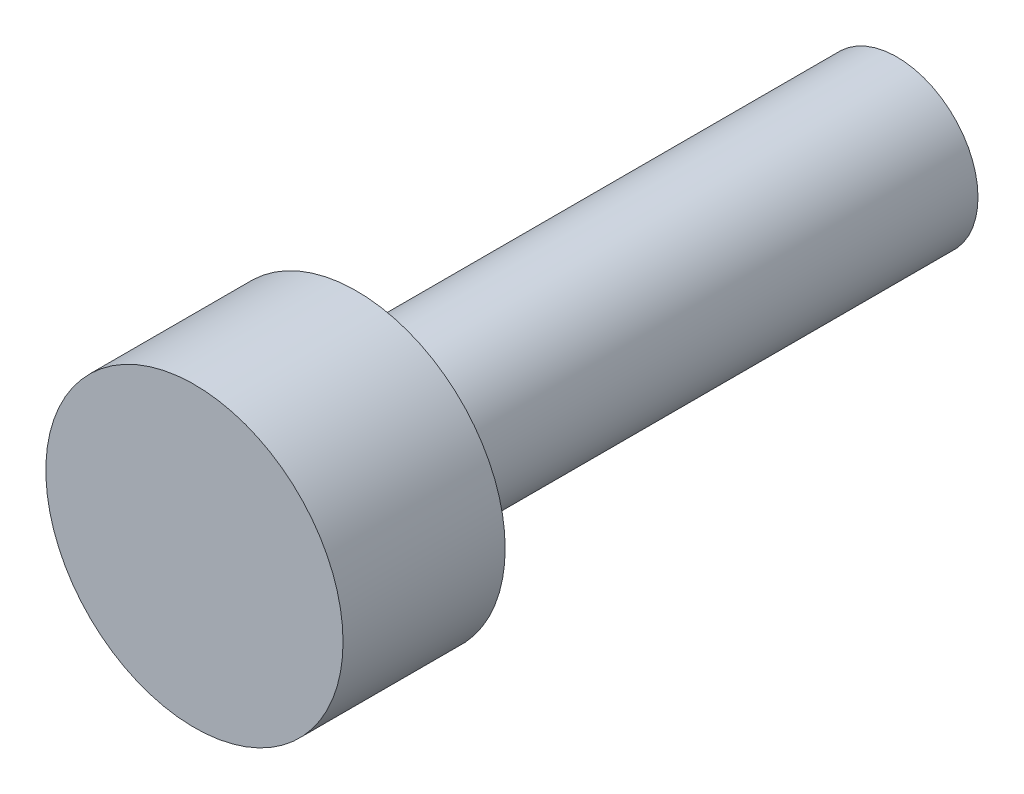
ISO-10303-21;
HEADER;
FILE_DESCRIPTION(('STEP AP214'),'2;1');
FILE_NAME('part.step','',(''),(''),'','','');
FILE_SCHEMA(('AUTOMOTIVE_DESIGN { 1 0 10303 214 1 1 1 1 }'));
ENDSEC;
DATA;
#1=APPLICATION_CONTEXT('core data for automotive mechanical design processes');
#2=APPLICATION_PROTOCOL_DEFINITION('international standard','automotive_design',2000,#1);
#3=PRODUCT_CONTEXT('',#1,'mechanical');
#4=PRODUCT('Part','Part','',(#3));
#5=PRODUCT_RELATED_PRODUCT_CATEGORY('part','',(#4));
#6=PRODUCT_DEFINITION_FORMATION('','',#4);
#7=PRODUCT_DEFINITION_CONTEXT('part definition',#1,'design');
#8=PRODUCT_DEFINITION('design','',#6,#7);
#9=PRODUCT_DEFINITION_SHAPE('','',#8);
#10=(LENGTH_UNIT() NAMED_UNIT(*) SI_UNIT(.MILLI.,.METRE.));
#11=(NAMED_UNIT(*) PLANE_ANGLE_UNIT() SI_UNIT($,.RADIAN.));
#12=(NAMED_UNIT(*) SI_UNIT($,.STERADIAN.) SOLID_ANGLE_UNIT());
#13=UNCERTAINTY_MEASURE_WITH_UNIT(LENGTH_MEASURE(1.E-05),#10,'distance_accuracy_value','');
#14=(GEOMETRIC_REPRESENTATION_CONTEXT(3) GLOBAL_UNCERTAINTY_ASSIGNED_CONTEXT((#13)) GLOBAL_UNIT_ASSIGNED_CONTEXT((#10,
#11,#12)) REPRESENTATION_CONTEXT('',''));
#15=CARTESIAN_POINT('',(0.,0.,0.));
#16=DIRECTION('',(0.,0.,1.));
#17=DIRECTION('',(1.,0.,0.));
#18=AXIS2_PLACEMENT_3D('',#15,#16,#17);
#19=CARTESIAN_POINT('',(0.,0.,10.));
#20=DIRECTION('',(0.,0.,-1.));
#21=DIRECTION('',(-1.,0.,0.));
#22=AXIS2_PLACEMENT_3D('',#19,#20,#21);
#23=CYLINDRICAL_SURFACE('',#22,1.5);
#24=CARTESIAN_POINT('',(0.,0.,10.));
#25=DIRECTION('',(0.,0.,1.));
#26=DIRECTION('',(1.,0.,0.));
#27=AXIS2_PLACEMENT_3D('',#24,#25,#26);
#28=CIRCLE('',#27,1.5);
#29=CARTESIAN_POINT('',(1.5,0.,10.));
#30=VERTEX_POINT('',#29);
#31=EDGE_CURVE('E10',#30,#30,#28,.T.);
#32=ORIENTED_EDGE('',*,*,#31,.F.);
#33=EDGE_LOOP('',(#32));
#34=FACE_BOUND('',#33,.T.);
#35=CARTESIAN_POINT('',(0.,0.,0.));
#36=DIRECTION('',(0.,0.,1.));
#37=DIRECTION('',(1.,0.,0.));
#38=AXIS2_PLACEMENT_3D('',#35,#36,#37);
#39=CIRCLE('',#38,1.5);
#40=CARTESIAN_POINT('',(1.5,0.,0.));
#41=VERTEX_POINT('',#40);
#42=EDGE_CURVE('E46',#41,#41,#39,.T.);
#43=ORIENTED_EDGE('',*,*,#42,.T.);
#44=EDGE_LOOP('',(#43));
#45=FACE_BOUND('',#44,.T.);
#46=ADVANCED_FACE('F43',(#34,#45),#23,.T.);
#47=CARTESIAN_POINT('',(0.,0.,0.));
#48=DIRECTION('',(0.,0.,1.));
#49=DIRECTION('',(1.,0.,0.));
#50=AXIS2_PLACEMENT_3D('',#47,#48,#49);
#51=PLANE('',#50);
#52=ORIENTED_EDGE('',*,*,#42,.F.);
#53=EDGE_LOOP('',(#52));
#54=FACE_BOUND('',#53,.T.);
#55=ADVANCED_FACE('F68',(#54),#51,.F.);
#56=CARTESIAN_POINT('',(0.,0.,13.));
#57=DIRECTION('',(0.,0.,-1.));
#58=DIRECTION('',(-1.,0.,0.));
#59=AXIS2_PLACEMENT_3D('',#56,#57,#58);
#60=CYLINDRICAL_SURFACE('',#59,2.75);
#61=CARTESIAN_POINT('',(0.,0.,13.));
#62=DIRECTION('',(0.,0.,1.));
#63=DIRECTION('',(1.,0.,0.));
#64=AXIS2_PLACEMENT_3D('',#61,#62,#63);
#65=CIRCLE('',#64,2.75);
#66=CARTESIAN_POINT('',(2.75,0.,13.));
#67=VERTEX_POINT('',#66);
#68=EDGE_CURVE('E54',#67,#67,#65,.T.);
#69=ORIENTED_EDGE('',*,*,#68,.F.);
#70=EDGE_LOOP('',(#69));
#71=FACE_BOUND('',#70,.T.);
#72=CARTESIAN_POINT('',(0.,0.,10.));
#73=DIRECTION('',(0.,0.,1.));
#74=DIRECTION('',(1.,0.,0.));
#75=AXIS2_PLACEMENT_3D('',#72,#73,#74);
#76=CIRCLE('',#75,2.75);
#77=CARTESIAN_POINT('',(2.75,0.,10.));
#78=VERTEX_POINT('',#77);
#79=EDGE_CURVE('E60',#78,#78,#76,.T.);
#80=ORIENTED_EDGE('',*,*,#79,.T.);
#81=EDGE_LOOP('',(#80));
#82=FACE_BOUND('',#81,.T.);
#83=ADVANCED_FACE('F70',(#71,#82),#60,.T.);
#84=CARTESIAN_POINT('',(0.,0.,13.));
#85=DIRECTION('',(0.,0.,1.));
#86=DIRECTION('',(1.,0.,0.));
#87=AXIS2_PLACEMENT_3D('',#84,#85,#86);
#88=PLANE('',#87);
#89=ORIENTED_EDGE('',*,*,#68,.T.);
#90=EDGE_LOOP('',(#89));
#91=FACE_BOUND('',#90,.T.);
#92=ADVANCED_FACE('F64',(#91),#88,.T.);
#93=CARTESIAN_POINT('',(0.,0.,10.));
#94=DIRECTION('',(0.,0.,1.));
#95=DIRECTION('',(1.,0.,0.));
#96=AXIS2_PLACEMENT_3D('',#93,#94,#95);
#97=PLANE('',#96);
#98=ORIENTED_EDGE('',*,*,#31,.T.);
#99=EDGE_LOOP('',(#98));
#100=FACE_BOUND('',#99,.T.);
#101=ORIENTED_EDGE('',*,*,#79,.F.);
#102=EDGE_LOOP('',(#101));
#103=FACE_BOUND('',#102,.T.);
#104=ADVANCED_FACE('F72',(#100,#103),#97,.F.);
#105=CLOSED_SHELL('',(#46,#55,#83,#92,#104));
#106=MANIFOLD_SOLID_BREP('B2',#105);
#107=ADVANCED_BREP_SHAPE_REPRESENTATION('',(#18,#106),#14);
#108=SHAPE_DEFINITION_REPRESENTATION(#9,#107);
ENDSEC;
END-ISO-10303-21;
